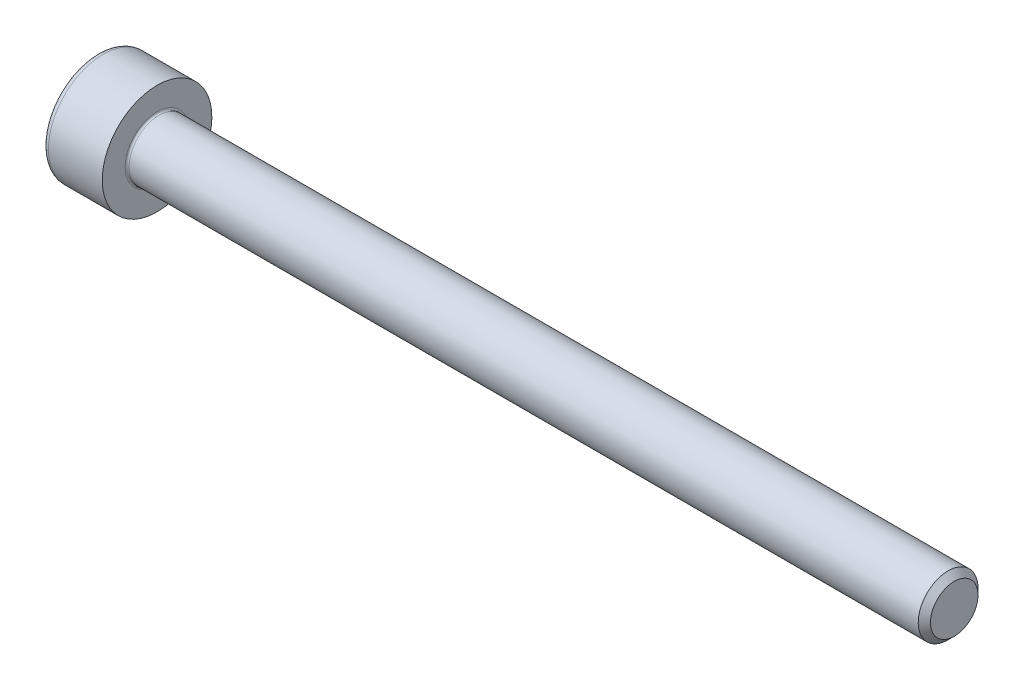
ISO-10303-21;
HEADER;
FILE_DESCRIPTION(('STEP AP214'),'2;1');
FILE_NAME('part.step','',(''),(''),'','','');
FILE_SCHEMA(('AUTOMOTIVE_DESIGN { 1 0 10303 214 1 1 1 1 }'));
ENDSEC;
DATA;
#1=APPLICATION_CONTEXT('core data for automotive mechanical design processes');
#2=APPLICATION_PROTOCOL_DEFINITION('international standard','automotive_design',2000,#1);
#3=PRODUCT_CONTEXT('',#1,'mechanical');
#4=PRODUCT('Part','Part','',(#3));
#5=PRODUCT_RELATED_PRODUCT_CATEGORY('part','',(#4));
#6=PRODUCT_DEFINITION_FORMATION('','',#4);
#7=PRODUCT_DEFINITION_CONTEXT('part definition',#1,'design');
#8=PRODUCT_DEFINITION('design','',#6,#7);
#9=PRODUCT_DEFINITION_SHAPE('','',#8);
#10=(LENGTH_UNIT() NAMED_UNIT(*) SI_UNIT(.MILLI.,.METRE.));
#11=(NAMED_UNIT(*) PLANE_ANGLE_UNIT() SI_UNIT($,.RADIAN.));
#12=(NAMED_UNIT(*) SI_UNIT($,.STERADIAN.) SOLID_ANGLE_UNIT());
#13=UNCERTAINTY_MEASURE_WITH_UNIT(LENGTH_MEASURE(1.E-05),#10,'distance_accuracy_value','');
#14=(GEOMETRIC_REPRESENTATION_CONTEXT(3) GLOBAL_UNCERTAINTY_ASSIGNED_CONTEXT((#13)) GLOBAL_UNIT_ASSIGNED_CONTEXT((#10,
#11,#12)) REPRESENTATION_CONTEXT('',''));
#15=CARTESIAN_POINT('',(0.,0.,0.));
#16=DIRECTION('',(0.,0.,1.));
#17=DIRECTION('',(1.,0.,0.));
#18=AXIS2_PLACEMENT_3D('',#15,#16,#17);
#19=CARTESIAN_POINT('',(0.100000000000002,0.,0.));
#20=DIRECTION('',(-1.,0.,0.));
#21=DIRECTION('',(0.,0.707106781186548,0.707106781186548));
#22=AXIS2_PLACEMENT_3D('',#19,#20,#21);
#23=TOROIDAL_SURFACE('',#22,1.6,0.1);
#24=CARTESIAN_POINT('',(0.,0.,0.));
#25=DIRECTION('',(1.,0.,0.));
#26=DIRECTION('',(0.,-1.,0.));
#27=AXIS2_PLACEMENT_3D('',#24,#25,#26);
#28=CIRCLE('',#27,1.6);
#29=CARTESIAN_POINT('',(0.,1.6,0.));
#30=VERTEX_POINT('',#29);
#31=EDGE_CURVE('E11',#30,#30,#28,.T.);
#32=ORIENTED_EDGE('',*,*,#31,.T.);
#33=EDGE_LOOP('',(#32));
#34=FACE_BOUND('',#33,.T.);
#35=CARTESIAN_POINT('',(0.100000000000002,0.,0.));
#36=DIRECTION('',(-1.,0.,0.));
#37=DIRECTION('',(0.,-1.,0.));
#38=AXIS2_PLACEMENT_3D('',#35,#36,#37);
#39=CIRCLE('',#38,1.5);
#40=CARTESIAN_POINT('',(0.100000000000002,1.5,0.));
#41=VERTEX_POINT('',#40);
#42=EDGE_CURVE('E29',#41,#41,#39,.T.);
#43=ORIENTED_EDGE('',*,*,#42,.T.);
#44=EDGE_LOOP('',(#43));
#45=FACE_BOUND('',#44,.T.);
#46=ADVANCED_FACE('F17',(#34,#45),#23,.F.);
#47=CARTESIAN_POINT('',(31.,0.,0.));
#48=DIRECTION('',(1.,0.,0.));
#49=DIRECTION('',(0.,1.,0.));
#50=AXIS2_PLACEMENT_3D('',#47,#48,#49);
#51=CYLINDRICAL_SURFACE('',#50,1.5);
#52=CARTESIAN_POINT('',(39.693275,0.,0.));
#53=DIRECTION('',(1.,0.,0.));
#54=DIRECTION('',(0.,-1.,0.));
#55=AXIS2_PLACEMENT_3D('',#52,#53,#54);
#56=CIRCLE('',#55,1.5);
#57=CARTESIAN_POINT('',(39.693275,1.5,0.));
#58=VERTEX_POINT('',#57);
#59=EDGE_CURVE('E241',#58,#58,#56,.T.);
#60=ORIENTED_EDGE('',*,*,#59,.F.);
#61=EDGE_LOOP('',(#60));
#62=FACE_BOUND('',#61,.T.);
#63=ORIENTED_EDGE('',*,*,#42,.F.);
#64=EDGE_LOOP('',(#63));
#65=FACE_BOUND('',#64,.T.);
#66=ADVANCED_FACE('F104',(#62,#65),#51,.T.);
#67=CARTESIAN_POINT('',(0.,2.125,0.));
#68=DIRECTION('',(1.,0.,0.));
#69=DIRECTION('',(0.,0.707106781186548,0.707106781186548));
#70=AXIS2_PLACEMENT_3D('',#67,#68,#69);
#71=PLANE('',#70);
#72=CARTESIAN_POINT('',(0.,0.,0.));
#73=DIRECTION('',(1.,0.,0.));
#74=DIRECTION('',(0.,1.,0.));
#75=AXIS2_PLACEMENT_3D('',#72,#73,#74);
#76=CIRCLE('',#75,2.75);
#77=CARTESIAN_POINT('',(0.,2.75,0.));
#78=VERTEX_POINT('',#77);
#79=EDGE_CURVE('E242',#78,#78,#76,.T.);
#80=ORIENTED_EDGE('',*,*,#79,.T.);
#81=EDGE_LOOP('',(#80));
#82=FACE_BOUND('',#81,.T.);
#83=ORIENTED_EDGE('',*,*,#31,.F.);
#84=EDGE_LOOP('',(#83));
#85=FACE_BOUND('',#84,.T.);
#86=ADVANCED_FACE('F110',(#82,#85),#71,.T.);
#87=CARTESIAN_POINT('',(39.8466375,0.,0.));
#88=DIRECTION('',(-1.,0.,0.));
#89=DIRECTION('',(0.,-1.,0.));
#90=AXIS2_PLACEMENT_3D('',#87,#88,#89);
#91=CONICAL_SURFACE('',#90,1.3466375,0.785398163397446);
#92=ORIENTED_EDGE('',*,*,#59,.T.);
#93=EDGE_LOOP('',(#92));
#94=FACE_BOUND('',#93,.T.);
#95=CARTESIAN_POINT('',(40.,0.,0.));
#96=DIRECTION('',(-1.,0.,0.));
#97=DIRECTION('',(0.,-1.,0.));
#98=AXIS2_PLACEMENT_3D('',#95,#96,#97);
#99=CIRCLE('',#98,1.193275);
#100=CARTESIAN_POINT('',(40.,1.193275,0.));
#101=VERTEX_POINT('',#100);
#102=EDGE_CURVE('E238',#101,#101,#99,.T.);
#103=ORIENTED_EDGE('',*,*,#102,.T.);
#104=EDGE_LOOP('',(#103));
#105=FACE_BOUND('',#104,.T.);
#106=ADVANCED_FACE('F117',(#94,#105),#91,.T.);
#107=CARTESIAN_POINT('',(40.,0.75,0.));
#108=DIRECTION('',(1.,0.,0.));
#109=DIRECTION('',(0.,0.707106781186548,0.707106781186548));
#110=AXIS2_PLACEMENT_3D('',#107,#108,#109);
#111=PLANE('',#110);
#112=ORIENTED_EDGE('',*,*,#102,.F.);
#113=EDGE_LOOP('',(#112));
#114=FACE_BOUND('',#113,.T.);
#115=ADVANCED_FACE('F121',(#114),#111,.T.);
#116=CARTESIAN_POINT('',(-2.7,0.,0.));
#117=DIRECTION('',(1.,0.,0.));
#118=DIRECTION('',(0.,0.707106781186548,0.707106781186548));
#119=AXIS2_PLACEMENT_3D('',#116,#117,#118);
#120=TOROIDAL_SURFACE('',#119,2.45,0.3);
#121=CARTESIAN_POINT('',(-3.,0.,0.));
#122=DIRECTION('',(1.,0.,0.));
#123=DIRECTION('',(0.,-1.,0.));
#124=AXIS2_PLACEMENT_3D('',#121,#122,#123);
#125=CIRCLE('',#124,2.45);
#126=CARTESIAN_POINT('',(-3.,2.45,0.));
#127=VERTEX_POINT('',#126);
#128=EDGE_CURVE('E235',#127,#127,#125,.T.);
#129=ORIENTED_EDGE('',*,*,#128,.T.);
#130=EDGE_LOOP('',(#129));
#131=FACE_BOUND('',#130,.T.);
#132=CARTESIAN_POINT('',(-2.7,0.,0.));
#133=DIRECTION('',(-1.,0.,0.));
#134=DIRECTION('',(0.,-1.,0.));
#135=AXIS2_PLACEMENT_3D('',#132,#133,#134);
#136=CIRCLE('',#135,2.75);
#137=CARTESIAN_POINT('',(-2.7,2.75,0.));
#138=VERTEX_POINT('',#137);
#139=EDGE_CURVE('E232',#138,#138,#136,.T.);
#140=ORIENTED_EDGE('',*,*,#139,.T.);
#141=EDGE_LOOP('',(#140));
#142=FACE_BOUND('',#141,.T.);
#143=ADVANCED_FACE('F125',(#131,#142),#120,.T.);
#144=CARTESIAN_POINT('',(-3.,2.09668783648703,0.));
#145=DIRECTION('',(-1.,0.,0.));
#146=DIRECTION('',(0.,0.707106781186548,0.707106781186548));
#147=AXIS2_PLACEMENT_3D('',#144,#145,#146);
#148=PLANE('',#147);
#149=DIRECTION('',(0.,0.,1.));
#150=VECTOR('',#149,1.);
#151=CARTESIAN_POINT('',(-3.,1.25,0.360843918243514));
#152=LINE('',#151,#150);
#153=CARTESIAN_POINT('',(-3.,1.25,-0.721687836487033));
#154=VERTEX_POINT('',#153);
#155=CARTESIAN_POINT('',(-3.,1.25,0.721687836487031));
#156=VERTEX_POINT('',#155);
#157=EDGE_CURVE('E229',#154,#156,#152,.T.);
#158=ORIENTED_EDGE('',*,*,#157,.T.);
#159=DIRECTION('',(0.,-0.866025403784438,0.5));
#160=VECTOR('',#159,1.);
#161=CARTESIAN_POINT('',(-3.,0.3125,1.26295371385231));
#162=LINE('',#161,#160);
#163=CARTESIAN_POINT('',(-3.,0.,1.44337567297406));
#164=VERTEX_POINT('',#163);
#165=EDGE_CURVE('E226',#156,#164,#162,.T.);
#166=ORIENTED_EDGE('',*,*,#165,.T.);
#167=DIRECTION('',(0.,-0.866025403784439,-0.5));
#168=VECTOR('',#167,1.);
#169=CARTESIAN_POINT('',(-3.,-0.9375,0.902109795608791));
#170=LINE('',#169,#168);
#171=CARTESIAN_POINT('',(-3.,-1.25,0.721687836487033));
#172=VERTEX_POINT('',#171);
#173=EDGE_CURVE('E223',#164,#172,#170,.T.);
#174=ORIENTED_EDGE('',*,*,#173,.T.);
#175=DIRECTION('',(0.,0.,-1.));
#176=VECTOR('',#175,1.);
#177=CARTESIAN_POINT('',(-3.,-1.25,-0.360843918243516));
#178=LINE('',#177,#176);
#179=CARTESIAN_POINT('',(-3.,-1.25,-0.721687836487032));
#180=VERTEX_POINT('',#179);
#181=EDGE_CURVE('E220',#172,#180,#178,.T.);
#182=ORIENTED_EDGE('',*,*,#181,.T.);
#183=DIRECTION('',(0.,0.866025403784439,-0.5));
#184=VECTOR('',#183,1.);
#185=CARTESIAN_POINT('',(-3.,-0.3125,-1.26295371385231));
#186=LINE('',#185,#184);
#187=CARTESIAN_POINT('',(-3.,0.,-1.44337567297406));
#188=VERTEX_POINT('',#187);
#189=EDGE_CURVE('E217',#180,#188,#186,.T.);
#190=ORIENTED_EDGE('',*,*,#189,.T.);
#191=DIRECTION('',(0.,0.866025403784439,0.5));
#192=VECTOR('',#191,1.);
#193=CARTESIAN_POINT('',(-3.,0.9375,-0.902109795608791));
#194=LINE('',#193,#192);
#195=EDGE_CURVE('E209',#188,#154,#194,.T.);
#196=ORIENTED_EDGE('',*,*,#195,.T.);
#197=EDGE_LOOP('',(#158,#166,#174,#182,#190,#196));
#198=FACE_BOUND('',#197,.T.);
#199=ORIENTED_EDGE('',*,*,#128,.F.);
#200=EDGE_LOOP('',(#199));
#201=FACE_BOUND('',#200,.T.);
#202=ADVANCED_FACE('F129',(#198,#201),#148,.T.);
#203=CARTESIAN_POINT('',(-1.5,0.,0.));
#204=DIRECTION('',(1.,0.,0.));
#205=DIRECTION('',(0.,1.,0.));
#206=AXIS2_PLACEMENT_3D('',#203,#204,#205);
#207=CYLINDRICAL_SURFACE('',#206,2.75);
#208=ORIENTED_EDGE('',*,*,#79,.F.);
#209=EDGE_LOOP('',(#208));
#210=FACE_BOUND('',#209,.T.);
#211=ORIENTED_EDGE('',*,*,#139,.F.);
#212=EDGE_LOOP('',(#211));
#213=FACE_BOUND('',#212,.T.);
#214=ADVANCED_FACE('F133',(#210,#213),#207,.T.);
#215=CARTESIAN_POINT('',(-3.,0.,-1.44337567297406));
#216=DIRECTION('',(0.,-0.5,-0.866025403784439));
#217=DIRECTION('',(0.447213595499958,-0.774596669241483,0.447213595499958));
#218=AXIS2_PLACEMENT_3D('',#215,#216,#217);
#219=PLANE('',#218);
#220=CARTESIAN_POINT('',(-1.5,0.,-1.44337567297407));
#221=CARTESIAN_POINT('',(-1.29166666666666,-0.625000000000001,-1.08253175473055));
#222=CARTESIAN_POINT('',(-1.5,-1.25000000000001,-0.721687836487024));
#223=(BOUNDED_CURVE() B_SPLINE_CURVE(2,(#220,#221,#222),.UNSPECIFIED.,.F.,
.F.) B_SPLINE_CURVE_WITH_KNOTS((3,3),(0.,0.146054517259743),
.UNSPECIFIED.) CURVE() GEOMETRIC_REPRESENTATION_ITEM() RATIONAL_B_SPLINE_CURVE((1.,
1.15470053837926,1.)) REPRESENTATION_ITEM(''));
#224=CARTESIAN_POINT('',(-1.5,0.,-1.44337567297406));
#225=VERTEX_POINT('',#224);
#226=CARTESIAN_POINT('',(-1.5,-1.25,-0.721687836487032));
#227=VERTEX_POINT('',#226);
#228=EDGE_CURVE('E164',#225,#227,#223,.T.);
#229=ORIENTED_EDGE('',*,*,#228,.F.);
#230=DIRECTION('',(-1.,0.,0.));
#231=VECTOR('',#230,1.);
#232=CARTESIAN_POINT('',(-2.25,0.,-1.44337567297406));
#233=LINE('',#232,#231);
#234=EDGE_CURVE('E200',#225,#188,#233,.T.);
#235=ORIENTED_EDGE('',*,*,#234,.T.);
#236=ORIENTED_EDGE('',*,*,#189,.F.);
#237=DIRECTION('',(-1.,0.,0.));
#238=VECTOR('',#237,1.);
#239=CARTESIAN_POINT('',(-2.25,-1.25,-0.721687836487033));
#240=LINE('',#239,#238);
#241=EDGE_CURVE('E160',#227,#180,#240,.T.);
#242=ORIENTED_EDGE('',*,*,#241,.F.);
#243=EDGE_LOOP('',(#229,#235,#236,#242));
#244=FACE_BOUND('',#243,.T.);
#245=ADVANCED_FACE('F137',(#244),#219,.F.);
#246=CARTESIAN_POINT('',(-3.,1.25,-0.721687836487033));
#247=DIRECTION('',(0.,0.5,-0.866025403784439));
#248=DIRECTION('',(0.654653670707977,0.654653670707977,0.377964473009227));
#249=AXIS2_PLACEMENT_3D('',#246,#247,#248);
#250=PLANE('',#249);
#251=CARTESIAN_POINT('',(-1.5,1.25000000000001,-0.721687836487025));
#252=CARTESIAN_POINT('',(-1.29166666666666,0.625000000000001,-1.08253175473054));
#253=CARTESIAN_POINT('',(-1.5,0.,-1.44337567297407));
#254=(BOUNDED_CURVE() B_SPLINE_CURVE(2,(#251,#252,#253),.UNSPECIFIED.,.F.,
.F.) B_SPLINE_CURVE_WITH_KNOTS((3,3),(0.,0.146054517259743),
.UNSPECIFIED.) CURVE() GEOMETRIC_REPRESENTATION_ITEM() RATIONAL_B_SPLINE_CURVE((1.,
1.15470053837926,1.)) REPRESENTATION_ITEM(''));
#255=CARTESIAN_POINT('',(-1.5,1.25,-0.721687836487035));
#256=VERTEX_POINT('',#255);
#257=EDGE_CURVE('E166',#256,#225,#254,.T.);
#258=ORIENTED_EDGE('',*,*,#257,.F.);
#259=DIRECTION('',(-1.,0.,0.));
#260=VECTOR('',#259,1.);
#261=CARTESIAN_POINT('',(-2.25,1.25,-0.721687836487034));
#262=LINE('',#261,#260);
#263=EDGE_CURVE('E191',#256,#154,#262,.T.);
#264=ORIENTED_EDGE('',*,*,#263,.T.);
#265=ORIENTED_EDGE('',*,*,#195,.F.);
#266=ORIENTED_EDGE('',*,*,#234,.F.);
#267=EDGE_LOOP('',(#258,#264,#265,#266));
#268=FACE_BOUND('',#267,.T.);
#269=ADVANCED_FACE('F141',(#268),#250,.F.);
#270=CARTESIAN_POINT('',(-3.,1.25,0.721687836487031));
#271=DIRECTION('',(0.,1.,0.));
#272=DIRECTION('',(0.707106781186548,0.,0.707106781186548));
#273=AXIS2_PLACEMENT_3D('',#270,#271,#272);
#274=PLANE('',#273);
#275=CARTESIAN_POINT('',(-1.5,1.25,0.721687836487046));
#276=CARTESIAN_POINT('',(-1.29166666666665,1.25,0.));
#277=CARTESIAN_POINT('',(-1.5,1.25,-0.721687836487049));
#278=(BOUNDED_CURVE() B_SPLINE_CURVE(2,(#275,#276,#277),.UNSPECIFIED.,.F.,
.F.) B_SPLINE_CURVE_WITH_KNOTS((3,3),(0.,0.146054517259743),
.UNSPECIFIED.) CURVE() GEOMETRIC_REPRESENTATION_ITEM() RATIONAL_B_SPLINE_CURVE((1.,
1.15470053837925,1.)) REPRESENTATION_ITEM(''));
#279=CARTESIAN_POINT('',(-1.5,1.25,0.72168783648703));
#280=VERTEX_POINT('',#279);
#281=EDGE_CURVE('E181',#280,#256,#278,.T.);
#282=ORIENTED_EDGE('',*,*,#281,.F.);
#283=DIRECTION('',(-1.,0.,0.));
#284=VECTOR('',#283,1.);
#285=CARTESIAN_POINT('',(-2.25,1.25,0.72168783648703));
#286=LINE('',#285,#284);
#287=EDGE_CURVE('E176',#280,#156,#286,.T.);
#288=ORIENTED_EDGE('',*,*,#287,.T.);
#289=ORIENTED_EDGE('',*,*,#157,.F.);
#290=ORIENTED_EDGE('',*,*,#263,.F.);
#291=EDGE_LOOP('',(#282,#288,#289,#290));
#292=FACE_BOUND('',#291,.T.);
#293=ADVANCED_FACE('F145',(#292),#274,.F.);
#294=CARTESIAN_POINT('',(-3.,0.,1.44337567297406));
#295=DIRECTION('',(0.,0.5,0.866025403784438));
#296=DIRECTION('',(0.447213595499959,-0.774596669241483,0.447213595499959));
#297=AXIS2_PLACEMENT_3D('',#294,#295,#296);
#298=PLANE('',#297);
#299=CARTESIAN_POINT('',(-1.5,0.,1.44337567297407));
#300=CARTESIAN_POINT('',(-1.29166666666665,0.625,1.08253175473054));
#301=CARTESIAN_POINT('',(-1.5,1.25000000000001,0.721687836487022));
#302=(BOUNDED_CURVE() B_SPLINE_CURVE(2,(#299,#300,#301),.UNSPECIFIED.,.F.,
.F.) B_SPLINE_CURVE_WITH_KNOTS((3,3),(0.,0.146054517259743),
.UNSPECIFIED.) CURVE() GEOMETRIC_REPRESENTATION_ITEM() RATIONAL_B_SPLINE_CURVE((1.,
1.15470053837926,1.)) REPRESENTATION_ITEM(''));
#303=CARTESIAN_POINT('',(-1.5,0.,1.44337567297406));
#304=VERTEX_POINT('',#303);
#305=EDGE_CURVE('E179',#304,#280,#302,.T.);
#306=ORIENTED_EDGE('',*,*,#305,.F.);
#307=DIRECTION('',(1.,0.,0.));
#308=VECTOR('',#307,1.);
#309=CARTESIAN_POINT('',(-2.25,0.,1.44337567297406));
#310=LINE('',#309,#308);
#311=EDGE_CURVE('E171',#164,#304,#310,.T.);
#312=ORIENTED_EDGE('',*,*,#311,.F.);
#313=ORIENTED_EDGE('',*,*,#165,.F.);
#314=ORIENTED_EDGE('',*,*,#287,.F.);
#315=EDGE_LOOP('',(#306,#312,#313,#314));
#316=FACE_BOUND('',#315,.T.);
#317=ADVANCED_FACE('F149',(#316),#298,.F.);
#318=CARTESIAN_POINT('',(-3.,-1.25,-0.721687836487032));
#319=DIRECTION('',(0.,-1.,0.));
#320=DIRECTION('',(0.707106781186548,0.,0.707106781186548));
#321=AXIS2_PLACEMENT_3D('',#318,#319,#320);
#322=PLANE('',#321);
#323=CARTESIAN_POINT('',(-1.5,-1.25,-0.721687836487048));
#324=CARTESIAN_POINT('',(-1.29166666666666,-1.25,0.));
#325=CARTESIAN_POINT('',(-1.5,-1.25,0.721687836487048));
#326=(BOUNDED_CURVE() B_SPLINE_CURVE(2,(#323,#324,#325),.UNSPECIFIED.,.F.,
.F.) B_SPLINE_CURVE_WITH_KNOTS((3,3),(0.,0.146054517259743),
.UNSPECIFIED.) CURVE() GEOMETRIC_REPRESENTATION_ITEM() RATIONAL_B_SPLINE_CURVE((1.,
1.15470053837926,1.)) REPRESENTATION_ITEM(''));
#327=CARTESIAN_POINT('',(-1.5,-1.25,0.721687836487032));
#328=VERTEX_POINT('',#327);
#329=EDGE_CURVE('E90',#227,#328,#326,.T.);
#330=ORIENTED_EDGE('',*,*,#329,.F.);
#331=ORIENTED_EDGE('',*,*,#241,.T.);
#332=ORIENTED_EDGE('',*,*,#181,.F.);
#333=DIRECTION('',(-1.,0.,0.));
#334=VECTOR('',#333,1.);
#335=CARTESIAN_POINT('',(-2.25,-1.25,0.721687836487032));
#336=LINE('',#335,#334);
#337=EDGE_CURVE('E162',#328,#172,#336,.T.);
#338=ORIENTED_EDGE('',*,*,#337,.F.);
#339=EDGE_LOOP('',(#330,#331,#332,#338));
#340=FACE_BOUND('',#339,.T.);
#341=ADVANCED_FACE('F100',(#340),#322,.F.);
#342=CARTESIAN_POINT('',(-3.,-1.25,0.721687836487033));
#343=DIRECTION('',(0.,-0.5,0.866025403784439));
#344=DIRECTION('',(0.654653670707977,0.654653670707977,0.377964473009227));
#345=AXIS2_PLACEMENT_3D('',#342,#343,#344);
#346=PLANE('',#345);
#347=CARTESIAN_POINT('',(-1.5,-1.25000000000001,0.721687836487025));
#348=CARTESIAN_POINT('',(-1.29166666666666,-0.625000000000001,1.08253175473054));
#349=CARTESIAN_POINT('',(-1.5,0.,1.44337567297407));
#350=(BOUNDED_CURVE() B_SPLINE_CURVE(2,(#347,#348,#349),.UNSPECIFIED.,.F.,
.F.) B_SPLINE_CURVE_WITH_KNOTS((3,3),(0.,0.146054517259743),
.UNSPECIFIED.) CURVE() GEOMETRIC_REPRESENTATION_ITEM() RATIONAL_B_SPLINE_CURVE((1.,
1.15470053837926,1.)) REPRESENTATION_ITEM(''));
#351=EDGE_CURVE('E21',#328,#304,#350,.T.);
#352=ORIENTED_EDGE('',*,*,#351,.F.);
#353=ORIENTED_EDGE('',*,*,#337,.T.);
#354=ORIENTED_EDGE('',*,*,#173,.F.);
#355=ORIENTED_EDGE('',*,*,#311,.T.);
#356=EDGE_LOOP('',(#352,#353,#354,#355));
#357=FACE_BOUND('',#356,.T.);
#358=ADVANCED_FACE('F95',(#357),#346,.F.);
#359=CARTESIAN_POINT('',(-1.08333333333332,0.,0.));
#360=DIRECTION('',(-1.,0.,0.));
#361=DIRECTION('',(0.,1.,0.));
#362=AXIS2_PLACEMENT_3D('',#359,#360,#361);
#363=CONICAL_SURFACE('',#362,0.721687836487032,1.0471975511966);
#364=ORIENTED_EDGE('',*,*,#305,.T.);
#365=ORIENTED_EDGE('',*,*,#281,.T.);
#366=ORIENTED_EDGE('',*,*,#257,.T.);
#367=ORIENTED_EDGE('',*,*,#228,.T.);
#368=ORIENTED_EDGE('',*,*,#329,.T.);
#369=ORIENTED_EDGE('',*,*,#351,.T.);
#370=EDGE_LOOP('',(#364,#365,#366,#367,#368,#369));
#371=FACE_BOUND('',#370,.T.);
#372=CARTESIAN_POINT('',(-0.66666666666666,0.,0.));
#373=VERTEX_POINT('',#372);
#374=VERTEX_LOOP('',#373);
#375=FACE_BOUND('',#374,.T.);
#376=ADVANCED_FACE('F19',(#371,#375),#363,.F.);
#377=CLOSED_SHELL('',(#46,#66,#86,#106,#115,#143,#202,#214,#245,#269,#293,#317,#341,#358,#376));
#378=MANIFOLD_SOLID_BREP('B1',#377);
#379=ADVANCED_BREP_SHAPE_REPRESENTATION('',(#18,#378),#14);
#380=SHAPE_DEFINITION_REPRESENTATION(#9,#379);
ENDSEC;
END-ISO-10303-21;
